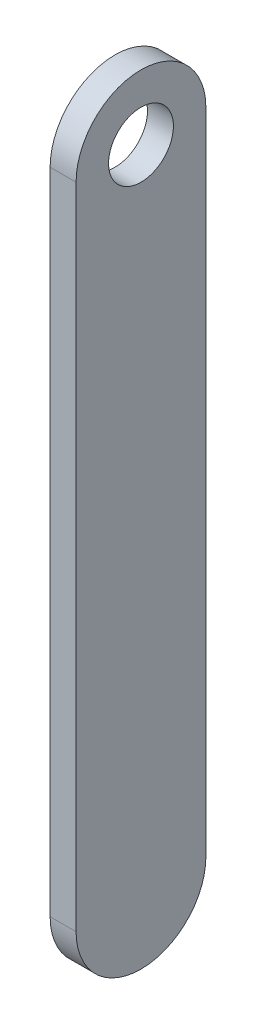
ISO-10303-21;
HEADER;
FILE_DESCRIPTION(('STEP AP214'),'2;1');
FILE_NAME('part.step','',(''),(''),'','','');
FILE_SCHEMA(('AUTOMOTIVE_DESIGN { 1 0 10303 214 1 1 1 1 }'));
ENDSEC;
DATA;
#1=APPLICATION_CONTEXT('core data for automotive mechanical design processes');
#2=APPLICATION_PROTOCOL_DEFINITION('international standard','automotive_design',2000,#1);
#3=PRODUCT_CONTEXT('',#1,'mechanical');
#4=PRODUCT('Part','Part','',(#3));
#5=PRODUCT_RELATED_PRODUCT_CATEGORY('part','',(#4));
#6=PRODUCT_DEFINITION_FORMATION('','',#4);
#7=PRODUCT_DEFINITION_CONTEXT('part definition',#1,'design');
#8=PRODUCT_DEFINITION('design','',#6,#7);
#9=PRODUCT_DEFINITION_SHAPE('','',#8);
#10=(LENGTH_UNIT() NAMED_UNIT(*) SI_UNIT(.MILLI.,.METRE.));
#11=(NAMED_UNIT(*) PLANE_ANGLE_UNIT() SI_UNIT($,.RADIAN.));
#12=(NAMED_UNIT(*) SI_UNIT($,.STERADIAN.) SOLID_ANGLE_UNIT());
#13=UNCERTAINTY_MEASURE_WITH_UNIT(LENGTH_MEASURE(1.E-05),#10,'distance_accuracy_value','');
#14=(GEOMETRIC_REPRESENTATION_CONTEXT(3) GLOBAL_UNCERTAINTY_ASSIGNED_CONTEXT((#13)) GLOBAL_UNIT_ASSIGNED_CONTEXT((#10,
#11,#12)) REPRESENTATION_CONTEXT('',''));
#15=CARTESIAN_POINT('',(0.,0.,0.));
#16=DIRECTION('',(0.,0.,1.));
#17=DIRECTION('',(1.,0.,0.));
#18=AXIS2_PLACEMENT_3D('',#15,#16,#17);
#19=CARTESIAN_POINT('',(-4.,0.,20.));
#20=DIRECTION('',(0.,0.,1.));
#21=DIRECTION('',(0.,-1.,0.));
#22=AXIS2_PLACEMENT_3D('',#19,#20,#21);
#23=PLANE('',#22);
#24=DIRECTION('',(1.,0.,0.));
#25=VECTOR('',#24,1.);
#26=CARTESIAN_POINT('',(-4.,-200.,20.));
#27=LINE('',#26,#25);
#28=CARTESIAN_POINT('',(-4.,-200.,20.));
#29=VERTEX_POINT('',#28);
#30=CARTESIAN_POINT('',(4.,-200.,20.));
#31=VERTEX_POINT('',#30);
#32=EDGE_CURVE('E36',#29,#31,#27,.T.);
#33=ORIENTED_EDGE('',*,*,#32,.T.);
#34=DIRECTION('',(0.,-1.,0.));
#35=VECTOR('',#34,1.);
#36=CARTESIAN_POINT('',(4.,0.,20.));
#37=LINE('',#36,#35);
#38=CARTESIAN_POINT('',(4.,0.,20.));
#39=VERTEX_POINT('',#38);
#40=EDGE_CURVE('E73',#39,#31,#37,.T.);
#41=ORIENTED_EDGE('',*,*,#40,.F.);
#42=DIRECTION('',(1.,0.,0.));
#43=VECTOR('',#42,1.);
#44=CARTESIAN_POINT('',(-4.,0.,20.));
#45=LINE('',#44,#43);
#46=CARTESIAN_POINT('',(-4.,0.,20.));
#47=VERTEX_POINT('',#46);
#48=EDGE_CURVE('E11',#47,#39,#45,.T.);
#49=ORIENTED_EDGE('',*,*,#48,.F.);
#50=DIRECTION('',(0.,-1.,0.));
#51=VECTOR('',#50,1.);
#52=CARTESIAN_POINT('',(-4.,0.,20.));
#53=LINE('',#52,#51);
#54=EDGE_CURVE('E74',#47,#29,#53,.T.);
#55=ORIENTED_EDGE('',*,*,#54,.T.);
#56=EDGE_LOOP('',(#33,#41,#49,#55));
#57=FACE_BOUND('',#56,.T.);
#58=ADVANCED_FACE('F33',(#57),#23,.T.);
#59=CARTESIAN_POINT('',(-4.,0.,0.));
#60=DIRECTION('',(1.,0.,0.));
#61=DIRECTION('',(0.,0.,-1.));
#62=AXIS2_PLACEMENT_3D('',#59,#60,#61);
#63=CYLINDRICAL_SURFACE('',#62,20.);
#64=ORIENTED_EDGE('',*,*,#48,.T.);
#65=CARTESIAN_POINT('',(4.,0.,0.));
#66=DIRECTION('',(1.,0.,0.));
#67=DIRECTION('',(0.,0.,-1.));
#68=AXIS2_PLACEMENT_3D('',#65,#66,#67);
#69=CIRCLE('',#68,20.);
#70=CARTESIAN_POINT('',(4.,0.,-20.));
#71=VERTEX_POINT('',#70);
#72=EDGE_CURVE('E92',#71,#39,#69,.T.);
#73=ORIENTED_EDGE('',*,*,#72,.F.);
#74=DIRECTION('',(1.,0.,0.));
#75=VECTOR('',#74,1.);
#76=CARTESIAN_POINT('',(-4.,0.,-20.));
#77=LINE('',#76,#75);
#78=CARTESIAN_POINT('',(-4.,0.,-20.));
#79=VERTEX_POINT('',#78);
#80=EDGE_CURVE('E41',#79,#71,#77,.T.);
#81=ORIENTED_EDGE('',*,*,#80,.F.);
#82=CARTESIAN_POINT('',(-4.,0.,0.));
#83=DIRECTION('',(1.,0.,0.));
#84=DIRECTION('',(0.,0.,-1.));
#85=AXIS2_PLACEMENT_3D('',#82,#83,#84);
#86=CIRCLE('',#85,20.);
#87=EDGE_CURVE('E105',#79,#47,#86,.T.);
#88=ORIENTED_EDGE('',*,*,#87,.T.);
#89=EDGE_LOOP('',(#64,#73,#81,#88));
#90=FACE_BOUND('',#89,.T.);
#91=ADVANCED_FACE('F112',(#90),#63,.T.);
#92=CARTESIAN_POINT('',(-4.,0.,-20.));
#93=DIRECTION('',(0.,0.,1.));
#94=DIRECTION('',(0.,-1.,0.));
#95=AXIS2_PLACEMENT_3D('',#92,#93,#94);
#96=PLANE('',#95);
#97=ORIENTED_EDGE('',*,*,#80,.T.);
#98=DIRECTION('',(0.,-1.,0.));
#99=VECTOR('',#98,1.);
#100=CARTESIAN_POINT('',(4.,0.,-20.));
#101=LINE('',#100,#99);
#102=CARTESIAN_POINT('',(4.,-200.,-20.));
#103=VERTEX_POINT('',#102);
#104=EDGE_CURVE('E87',#71,#103,#101,.T.);
#105=ORIENTED_EDGE('',*,*,#104,.T.);
#106=DIRECTION('',(1.,0.,0.));
#107=VECTOR('',#106,1.);
#108=CARTESIAN_POINT('',(-4.,-200.,-20.));
#109=LINE('',#108,#107);
#110=CARTESIAN_POINT('',(-4.,-200.,-20.));
#111=VERTEX_POINT('',#110);
#112=EDGE_CURVE('E78',#111,#103,#109,.T.);
#113=ORIENTED_EDGE('',*,*,#112,.F.);
#114=DIRECTION('',(0.,-1.,0.));
#115=VECTOR('',#114,1.);
#116=CARTESIAN_POINT('',(-4.,0.,-20.));
#117=LINE('',#116,#115);
#118=EDGE_CURVE('E103',#79,#111,#117,.T.);
#119=ORIENTED_EDGE('',*,*,#118,.F.);
#120=EDGE_LOOP('',(#97,#105,#113,#119));
#121=FACE_BOUND('',#120,.T.);
#122=ADVANCED_FACE('F110',(#121),#96,.F.);
#123=CARTESIAN_POINT('',(-4.,-200.,0.));
#124=DIRECTION('',(1.,0.,0.));
#125=DIRECTION('',(0.,0.,-1.));
#126=AXIS2_PLACEMENT_3D('',#123,#124,#125);
#127=CYLINDRICAL_SURFACE('',#126,20.);
#128=ORIENTED_EDGE('',*,*,#112,.T.);
#129=CARTESIAN_POINT('',(4.,-200.,0.));
#130=DIRECTION('',(1.,0.,0.));
#131=DIRECTION('',(0.,0.,-1.));
#132=AXIS2_PLACEMENT_3D('',#129,#130,#131);
#133=CIRCLE('',#132,20.);
#134=EDGE_CURVE('E81',#31,#103,#133,.T.);
#135=ORIENTED_EDGE('',*,*,#134,.F.);
#136=ORIENTED_EDGE('',*,*,#32,.F.);
#137=CARTESIAN_POINT('',(-4.,-200.,0.));
#138=DIRECTION('',(1.,0.,0.));
#139=DIRECTION('',(0.,0.,-1.));
#140=AXIS2_PLACEMENT_3D('',#137,#138,#139);
#141=CIRCLE('',#140,20.);
#142=EDGE_CURVE('E101',#29,#111,#141,.T.);
#143=ORIENTED_EDGE('',*,*,#142,.T.);
#144=EDGE_LOOP('',(#128,#135,#136,#143));
#145=FACE_BOUND('',#144,.T.);
#146=ADVANCED_FACE('F82',(#145),#127,.T.);
#147=CARTESIAN_POINT('',(-4.,0.,0.));
#148=DIRECTION('',(1.,0.,0.));
#149=DIRECTION('',(0.,0.,-1.));
#150=AXIS2_PLACEMENT_3D('',#147,#148,#149);
#151=CYLINDRICAL_SURFACE('',#150,10.);
#152=CARTESIAN_POINT('',(-4.,0.,0.));
#153=DIRECTION('',(1.,0.,0.));
#154=DIRECTION('',(0.,0.,-1.));
#155=AXIS2_PLACEMENT_3D('',#152,#153,#154);
#156=CIRCLE('',#155,10.);
#157=CARTESIAN_POINT('',(-4.,0.,-10.));
#158=VERTEX_POINT('',#157);
#159=EDGE_CURVE('E79',#158,#158,#156,.T.);
#160=ORIENTED_EDGE('',*,*,#159,.F.);
#161=EDGE_LOOP('',(#160));
#162=FACE_BOUND('',#161,.T.);
#163=CARTESIAN_POINT('',(4.,0.,0.));
#164=DIRECTION('',(1.,0.,0.));
#165=DIRECTION('',(0.,0.,-1.));
#166=AXIS2_PLACEMENT_3D('',#163,#164,#165);
#167=CIRCLE('',#166,10.);
#168=CARTESIAN_POINT('',(4.,0.,-10.));
#169=VERTEX_POINT('',#168);
#170=EDGE_CURVE('E97',#169,#169,#167,.T.);
#171=ORIENTED_EDGE('',*,*,#170,.T.);
#172=EDGE_LOOP('',(#171));
#173=FACE_BOUND('',#172,.T.);
#174=ADVANCED_FACE('F117',(#162,#173),#151,.F.);
#175=CARTESIAN_POINT('',(-4.,0.,0.));
#176=DIRECTION('',(1.,0.,0.));
#177=DIRECTION('',(0.,0.,-1.));
#178=AXIS2_PLACEMENT_3D('',#175,#176,#177);
#179=PLANE('',#178);
#180=ORIENTED_EDGE('',*,*,#54,.F.);
#181=ORIENTED_EDGE('',*,*,#87,.F.);
#182=ORIENTED_EDGE('',*,*,#118,.T.);
#183=ORIENTED_EDGE('',*,*,#142,.F.);
#184=EDGE_LOOP('',(#180,#181,#182,#183));
#185=FACE_BOUND('',#184,.T.);
#186=ORIENTED_EDGE('',*,*,#159,.T.);
#187=EDGE_LOOP('',(#186));
#188=FACE_BOUND('',#187,.T.);
#189=ADVANCED_FACE('F114',(#185,#188),#179,.F.);
#190=CARTESIAN_POINT('',(4.,0.,0.));
#191=DIRECTION('',(1.,0.,0.));
#192=DIRECTION('',(0.,0.,-1.));
#193=AXIS2_PLACEMENT_3D('',#190,#191,#192);
#194=PLANE('',#193);
#195=ORIENTED_EDGE('',*,*,#40,.T.);
#196=ORIENTED_EDGE('',*,*,#134,.T.);
#197=ORIENTED_EDGE('',*,*,#104,.F.);
#198=ORIENTED_EDGE('',*,*,#72,.T.);
#199=EDGE_LOOP('',(#195,#196,#197,#198));
#200=FACE_BOUND('',#199,.T.);
#201=ORIENTED_EDGE('',*,*,#170,.F.);
#202=EDGE_LOOP('',(#201));
#203=FACE_BOUND('',#202,.T.);
#204=ADVANCED_FACE('F90',(#200,#203),#194,.T.);
#205=CLOSED_SHELL('',(#58,#91,#122,#146,#174,#189,#204));
#206=MANIFOLD_SOLID_BREP('B2',#205);
#207=ADVANCED_BREP_SHAPE_REPRESENTATION('',(#18,#206),#14);
#208=SHAPE_DEFINITION_REPRESENTATION(#9,#207);
ENDSEC;
END-ISO-10303-21;
